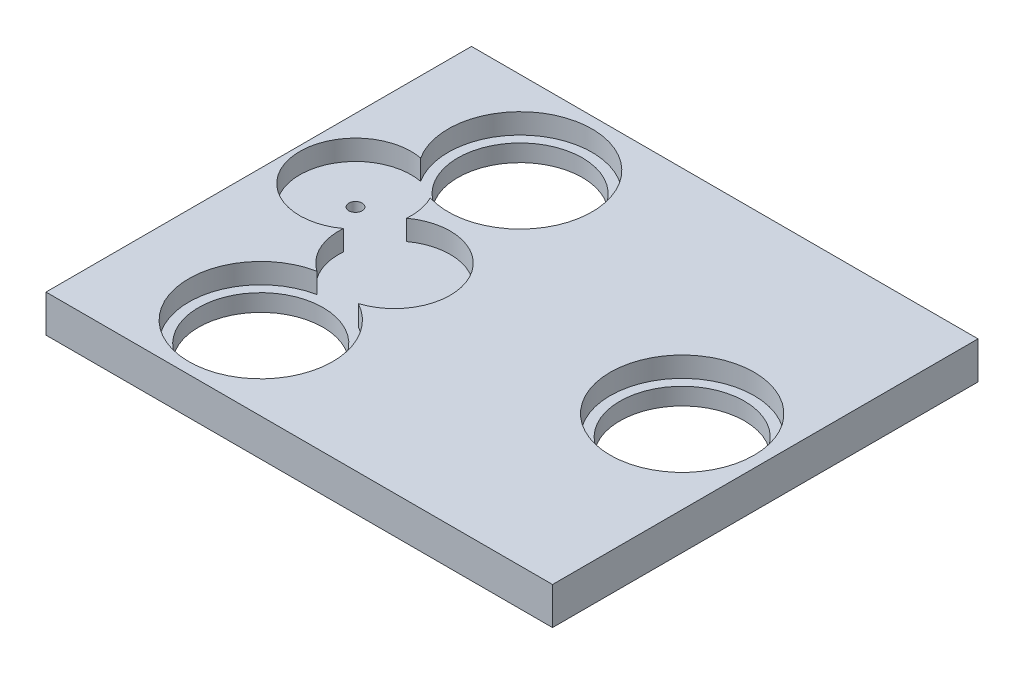
ISO-10303-21;
HEADER;
FILE_DESCRIPTION(('STEP AP214'),'2;1');
FILE_NAME('part.step','',(''),(''),'','','');
FILE_SCHEMA(('AUTOMOTIVE_DESIGN { 1 0 10303 214 1 1 1 1 }'));
ENDSEC;
DATA;
#1=APPLICATION_CONTEXT('core data for automotive mechanical design processes');
#2=APPLICATION_PROTOCOL_DEFINITION('international standard','automotive_design',2000,#1);
#3=PRODUCT_CONTEXT('',#1,'mechanical');
#4=PRODUCT('Part','Part','',(#3));
#5=PRODUCT_RELATED_PRODUCT_CATEGORY('part','',(#4));
#6=PRODUCT_DEFINITION_FORMATION('','',#4);
#7=PRODUCT_DEFINITION_CONTEXT('part definition',#1,'design');
#8=PRODUCT_DEFINITION('design','',#6,#7);
#9=PRODUCT_DEFINITION_SHAPE('','',#8);
#10=(LENGTH_UNIT() NAMED_UNIT(*) SI_UNIT(.MILLI.,.METRE.));
#11=(NAMED_UNIT(*) PLANE_ANGLE_UNIT() SI_UNIT($,.RADIAN.));
#12=(NAMED_UNIT(*) SI_UNIT($,.STERADIAN.) SOLID_ANGLE_UNIT());
#13=UNCERTAINTY_MEASURE_WITH_UNIT(LENGTH_MEASURE(1.E-05),#10,'distance_accuracy_value','');
#14=(GEOMETRIC_REPRESENTATION_CONTEXT(3) GLOBAL_UNCERTAINTY_ASSIGNED_CONTEXT((#13)) GLOBAL_UNIT_ASSIGNED_CONTEXT((#10,
#11,#12)) REPRESENTATION_CONTEXT('',''));
#15=CARTESIAN_POINT('',(0.,0.,0.));
#16=DIRECTION('',(0.,0.,1.));
#17=DIRECTION('',(1.,0.,0.));
#18=AXIS2_PLACEMENT_3D('',#15,#16,#17);
#19=CARTESIAN_POINT('',(62.5,9.215,52.5));
#20=DIRECTION('',(-1.,0.,0.));
#21=DIRECTION('',(0.,0.,1.));
#22=AXIS2_PLACEMENT_3D('',#19,#20,#21);
#23=PLANE('',#22);
#24=DIRECTION('',(0.,0.,-1.));
#25=VECTOR('',#24,1.);
#26=CARTESIAN_POINT('',(62.5,0.,52.5));
#27=LINE('',#26,#25);
#28=CARTESIAN_POINT('',(62.5,0.,52.5));
#29=VERTEX_POINT('',#28);
#30=CARTESIAN_POINT('',(62.5,0.,-52.5));
#31=VERTEX_POINT('',#30);
#32=EDGE_CURVE('E179',#29,#31,#27,.T.);
#33=ORIENTED_EDGE('',*,*,#32,.T.);
#34=DIRECTION('',(0.,-1.,0.));
#35=VECTOR('',#34,1.);
#36=CARTESIAN_POINT('',(62.5,9.215,-52.5));
#37=LINE('',#36,#35);
#38=CARTESIAN_POINT('',(62.5,9.215,-52.5));
#39=VERTEX_POINT('',#38);
#40=EDGE_CURVE('E11',#39,#31,#37,.T.);
#41=ORIENTED_EDGE('',*,*,#40,.F.);
#42=DIRECTION('',(0.,0.,-1.));
#43=VECTOR('',#42,1.);
#44=CARTESIAN_POINT('',(62.5,9.215,52.5));
#45=LINE('',#44,#43);
#46=CARTESIAN_POINT('',(62.5,9.215,52.5));
#47=VERTEX_POINT('',#46);
#48=EDGE_CURVE('E180',#47,#39,#45,.T.);
#49=ORIENTED_EDGE('',*,*,#48,.F.);
#50=DIRECTION('',(0.,-1.,0.));
#51=VECTOR('',#50,1.);
#52=CARTESIAN_POINT('',(62.5,9.215,52.5));
#53=LINE('',#52,#51);
#54=EDGE_CURVE('E186',#47,#29,#53,.T.);
#55=ORIENTED_EDGE('',*,*,#54,.T.);
#56=EDGE_LOOP('',(#33,#41,#49,#55));
#57=FACE_BOUND('',#56,.T.);
#58=ADVANCED_FACE('F35',(#57),#23,.F.);
#59=CARTESIAN_POINT('',(-62.5,9.215,-52.5));
#60=DIRECTION('',(0.,0.,1.));
#61=DIRECTION('',(1.,0.,0.));
#62=AXIS2_PLACEMENT_3D('',#59,#60,#61);
#63=PLANE('',#62);
#64=DIRECTION('',(-1.,0.,0.));
#65=VECTOR('',#64,1.);
#66=CARTESIAN_POINT('',(-62.5,0.,-52.5));
#67=LINE('',#66,#65);
#68=CARTESIAN_POINT('',(-62.5,0.,-52.5));
#69=VERTEX_POINT('',#68);
#70=EDGE_CURVE('E189',#31,#69,#67,.T.);
#71=ORIENTED_EDGE('',*,*,#70,.T.);
#72=DIRECTION('',(0.,-1.,0.));
#73=VECTOR('',#72,1.);
#74=CARTESIAN_POINT('',(-62.5,9.215,-52.5));
#75=LINE('',#74,#73);
#76=CARTESIAN_POINT('',(-62.5,9.215,-52.5));
#77=VERTEX_POINT('',#76);
#78=EDGE_CURVE('E43',#77,#69,#75,.T.);
#79=ORIENTED_EDGE('',*,*,#78,.F.);
#80=DIRECTION('',(-1.,0.,0.));
#81=VECTOR('',#80,1.);
#82=CARTESIAN_POINT('',(-62.5,9.215,-52.5));
#83=LINE('',#82,#81);
#84=EDGE_CURVE('E88',#39,#77,#83,.T.);
#85=ORIENTED_EDGE('',*,*,#84,.F.);
#86=ORIENTED_EDGE('',*,*,#40,.T.);
#87=EDGE_LOOP('',(#71,#79,#85,#86));
#88=FACE_BOUND('',#87,.T.);
#89=ADVANCED_FACE('F223',(#88),#63,.F.);
#90=CARTESIAN_POINT('',(-62.5,9.215,52.5));
#91=DIRECTION('',(1.,0.,0.));
#92=DIRECTION('',(0.,0.,-1.));
#93=AXIS2_PLACEMENT_3D('',#90,#91,#92);
#94=PLANE('',#93);
#95=DIRECTION('',(0.,0.,1.));
#96=VECTOR('',#95,1.);
#97=CARTESIAN_POINT('',(-62.5,0.,52.5));
#98=LINE('',#97,#96);
#99=CARTESIAN_POINT('',(-62.5,0.,52.5));
#100=VERTEX_POINT('',#99);
#101=EDGE_CURVE('E191',#69,#100,#98,.T.);
#102=ORIENTED_EDGE('',*,*,#101,.T.);
#103=DIRECTION('',(0.,-1.,0.));
#104=VECTOR('',#103,1.);
#105=CARTESIAN_POINT('',(-62.5,9.215,52.5));
#106=LINE('',#105,#104);
#107=CARTESIAN_POINT('',(-62.5,9.215,52.5));
#108=VERTEX_POINT('',#107);
#109=EDGE_CURVE('E195',#108,#100,#106,.T.);
#110=ORIENTED_EDGE('',*,*,#109,.F.);
#111=DIRECTION('',(0.,0.,1.));
#112=VECTOR('',#111,1.);
#113=CARTESIAN_POINT('',(-62.5,9.215,52.5));
#114=LINE('',#113,#112);
#115=EDGE_CURVE('E183',#77,#108,#114,.T.);
#116=ORIENTED_EDGE('',*,*,#115,.F.);
#117=ORIENTED_EDGE('',*,*,#78,.T.);
#118=EDGE_LOOP('',(#102,#110,#116,#117));
#119=FACE_BOUND('',#118,.T.);
#120=ADVANCED_FACE('F228',(#119),#94,.F.);
#121=CARTESIAN_POINT('',(-62.5,9.215,52.5));
#122=DIRECTION('',(0.,0.,-1.));
#123=DIRECTION('',(-1.,0.,0.));
#124=AXIS2_PLACEMENT_3D('',#121,#122,#123);
#125=PLANE('',#124);
#126=DIRECTION('',(1.,0.,0.));
#127=VECTOR('',#126,1.);
#128=CARTESIAN_POINT('',(-62.5,0.,52.5));
#129=LINE('',#128,#127);
#130=EDGE_CURVE('E81',#100,#29,#129,.T.);
#131=ORIENTED_EDGE('',*,*,#130,.T.);
#132=ORIENTED_EDGE('',*,*,#54,.F.);
#133=DIRECTION('',(1.,0.,0.));
#134=VECTOR('',#133,1.);
#135=CARTESIAN_POINT('',(-62.5,9.215,52.5));
#136=LINE('',#135,#134);
#137=EDGE_CURVE('E60',#108,#47,#136,.T.);
#138=ORIENTED_EDGE('',*,*,#137,.F.);
#139=ORIENTED_EDGE('',*,*,#109,.T.);
#140=EDGE_LOOP('',(#131,#132,#138,#139));
#141=FACE_BOUND('',#140,.T.);
#142=ADVANCED_FACE('F240',(#141),#125,.F.);
#143=CARTESIAN_POINT('',(0.,9.215,0.));
#144=DIRECTION('',(0.,-1.,0.));
#145=DIRECTION('',(0.,0.,-1.));
#146=AXIS2_PLACEMENT_3D('',#143,#144,#145);
#147=PLANE('',#146);
#148=CARTESIAN_POINT('',(-47.5,9.215,-8.87533784030565));
#149=DIRECTION('',(0.,-1.,0.));
#150=DIRECTION('',(0.,0.,-1.));
#151=AXIS2_PLACEMENT_3D('',#148,#149,#150);
#152=CIRCLE('',#151,13.75);
#153=CARTESIAN_POINT('',(-44.917446939934,9.215,-22.3806301248859));
#154=VERTEX_POINT('',#153);
#155=CARTESIAN_POINT('',(-39.3843908448113,9.215,2.22418413319473));
#156=VERTEX_POINT('',#155);
#157=EDGE_CURVE('E402',#154,#156,#152,.F.);
#158=ORIENTED_EDGE('',*,*,#157,.F.);
#159=CARTESIAN_POINT('',(-30.,9.215,-32.));
#160=DIRECTION('',(0.,-1.,0.));
#161=DIRECTION('',(0.,0.,-1.));
#162=AXIS2_PLACEMENT_3D('',#159,#160,#161);
#163=CIRCLE('',#162,17.75);
#164=CARTESIAN_POINT('',(-35.2044317758804,9.215,-15.0301328853109));
#165=VERTEX_POINT('',#164);
#166=EDGE_CURVE('E149',#165,#154,#163,.F.);
#167=ORIENTED_EDGE('',*,*,#166,.F.);
#168=CARTESIAN_POINT('',(-47.5,9.215,-8.87533784030565));
#169=DIRECTION('',(0.,-1.,0.));
#170=DIRECTION('',(0.,0.,-1.));
#171=AXIS2_PLACEMENT_3D('',#168,#169,#170);
#172=CIRCLE('',#171,13.75);
#173=CARTESIAN_POINT('',(-33.7940403662171,9.215,-7.77571494262004));
#174=VERTEX_POINT('',#173);
#175=EDGE_CURVE('E125',#174,#165,#172,.F.);
#176=ORIENTED_EDGE('',*,*,#175,.F.);
#177=CARTESIAN_POINT('',(-25.6784312110284,9.215,3.32380703088033));
#178=DIRECTION('',(0.,-1.,0.));
#179=DIRECTION('',(0.,0.,-1.));
#180=AXIS2_PLACEMENT_3D('',#177,#178,#179);
#181=CIRCLE('',#180,13.75);
#182=CARTESIAN_POINT('',(-21.4930754201494,9.215,16.42133721423));
#183=VERTEX_POINT('',#182);
#184=EDGE_CURVE('E158',#183,#174,#181,.F.);
#185=ORIENTED_EDGE('',*,*,#184,.F.);
#186=CARTESIAN_POINT('',(-30.,9.215,32.));
#187=DIRECTION('',(0.,-1.,0.));
#188=DIRECTION('',(0.,0.,-1.));
#189=AXIS2_PLACEMENT_3D('',#186,#187,#188);
#190=CIRCLE('',#189,17.75);
#191=CARTESIAN_POINT('',(-33.5378912636371,9.215,14.6061555311461));
#192=VERTEX_POINT('',#191);
#193=EDGE_CURVE('E399',#192,#183,#190,.F.);
#194=ORIENTED_EDGE('',*,*,#193,.F.);
#195=CARTESIAN_POINT('',(-25.6784312110284,9.215,3.32380703088033));
#196=DIRECTION('',(0.,-1.,0.));
#197=DIRECTION('',(0.,0.,-1.));
#198=AXIS2_PLACEMENT_3D('',#195,#196,#197);
#199=CIRCLE('',#198,13.75);
#200=EDGE_CURVE('E403',#156,#192,#199,.F.);
#201=ORIENTED_EDGE('',*,*,#200,.F.);
#202=EDGE_LOOP('',(#158,#167,#176,#185,#194,#201));
#203=FACE_BOUND('',#202,.T.);
#204=CARTESIAN_POINT('',(42.,9.215,0.));
#205=DIRECTION('',(0.,-1.,0.));
#206=DIRECTION('',(0.,0.,-1.));
#207=AXIS2_PLACEMENT_3D('',#204,#205,#206);
#208=CIRCLE('',#207,17.75);
#209=CARTESIAN_POINT('',(42.,9.215,-17.75));
#210=VERTEX_POINT('',#209);
#211=EDGE_CURVE('E176',#210,#210,#208,.F.);
#212=ORIENTED_EDGE('',*,*,#211,.F.);
#213=EDGE_LOOP('',(#212));
#214=FACE_BOUND('',#213,.T.);
#215=ORIENTED_EDGE('',*,*,#48,.T.);
#216=ORIENTED_EDGE('',*,*,#84,.T.);
#217=ORIENTED_EDGE('',*,*,#115,.T.);
#218=ORIENTED_EDGE('',*,*,#137,.T.);
#219=EDGE_LOOP('',(#215,#216,#217,#218));
#220=FACE_BOUND('',#219,.T.);
#221=ADVANCED_FACE('F238',(#203,#214,#220),#147,.F.);
#222=CARTESIAN_POINT('',(0.,0.,0.));
#223=DIRECTION('',(0.,-1.,0.));
#224=DIRECTION('',(0.,0.,-1.));
#225=AXIS2_PLACEMENT_3D('',#222,#223,#224);
#226=PLANE('',#225);
#227=CARTESIAN_POINT('',(-30.,0.,32.));
#228=DIRECTION('',(0.,-1.,0.));
#229=DIRECTION('',(0.,0.,-1.));
#230=AXIS2_PLACEMENT_3D('',#227,#228,#229);
#231=CIRCLE('',#230,15.375);
#232=CARTESIAN_POINT('',(-30.,0.,16.625));
#233=VERTEX_POINT('',#232);
#234=EDGE_CURVE('E201',#233,#233,#231,.T.);
#235=ORIENTED_EDGE('',*,*,#234,.F.);
#236=EDGE_LOOP('',(#235));
#237=FACE_BOUND('',#236,.T.);
#238=CARTESIAN_POINT('',(-30.,0.,-32.));
#239=DIRECTION('',(0.,-1.,0.));
#240=DIRECTION('',(0.,0.,-1.));
#241=AXIS2_PLACEMENT_3D('',#238,#239,#240);
#242=CIRCLE('',#241,15.375);
#243=CARTESIAN_POINT('',(-30.,0.,-47.375));
#244=VERTEX_POINT('',#243);
#245=EDGE_CURVE('E411',#244,#244,#242,.T.);
#246=ORIENTED_EDGE('',*,*,#245,.F.);
#247=EDGE_LOOP('',(#246));
#248=FACE_BOUND('',#247,.T.);
#249=CARTESIAN_POINT('',(-47.5,0.,-8.87533784030565));
#250=DIRECTION('',(0.,-1.,0.));
#251=DIRECTION('',(0.,0.,-1.));
#252=AXIS2_PLACEMENT_3D('',#249,#250,#251);
#253=CIRCLE('',#252,1.65);
#254=CARTESIAN_POINT('',(-47.5,0.,-10.5253378403056));
#255=VERTEX_POINT('',#254);
#256=EDGE_CURVE('E408',#255,#255,#253,.T.);
#257=ORIENTED_EDGE('',*,*,#256,.F.);
#258=EDGE_LOOP('',(#257));
#259=FACE_BOUND('',#258,.T.);
#260=CARTESIAN_POINT('',(42.,0.,0.));
#261=DIRECTION('',(0.,-1.,0.));
#262=DIRECTION('',(0.,0.,-1.));
#263=AXIS2_PLACEMENT_3D('',#260,#261,#262);
#264=CIRCLE('',#263,15.375);
#265=CARTESIAN_POINT('',(42.,0.,-15.375));
#266=VERTEX_POINT('',#265);
#267=EDGE_CURVE('E167',#266,#266,#264,.T.);
#268=ORIENTED_EDGE('',*,*,#267,.F.);
#269=EDGE_LOOP('',(#268));
#270=FACE_BOUND('',#269,.T.);
#271=ORIENTED_EDGE('',*,*,#32,.F.);
#272=ORIENTED_EDGE('',*,*,#130,.F.);
#273=ORIENTED_EDGE('',*,*,#101,.F.);
#274=ORIENTED_EDGE('',*,*,#70,.F.);
#275=EDGE_LOOP('',(#271,#272,#273,#274));
#276=FACE_BOUND('',#275,.T.);
#277=ADVANCED_FACE('F233',(#237,#248,#259,#270,#276),#226,.T.);
#278=CARTESIAN_POINT('',(42.,59.4195814642449,0.));
#279=DIRECTION('',(0.,-1.,0.));
#280=DIRECTION('',(0.,0.,-1.));
#281=AXIS2_PLACEMENT_3D('',#278,#279,#280);
#282=CYLINDRICAL_SURFACE('',#281,17.75);
#283=ORIENTED_EDGE('',*,*,#211,.T.);
#284=EDGE_LOOP('',(#283));
#285=FACE_BOUND('',#284,.T.);
#286=CARTESIAN_POINT('',(42.,4.215,0.));
#287=DIRECTION('',(0.,-1.,0.));
#288=DIRECTION('',(0.,0.,-1.));
#289=AXIS2_PLACEMENT_3D('',#286,#287,#288);
#290=CIRCLE('',#289,17.75);
#291=CARTESIAN_POINT('',(42.,4.215,-17.75));
#292=VERTEX_POINT('',#291);
#293=EDGE_CURVE('E173',#292,#292,#290,.T.);
#294=ORIENTED_EDGE('',*,*,#293,.T.);
#295=EDGE_LOOP('',(#294));
#296=FACE_BOUND('',#295,.T.);
#297=ADVANCED_FACE('F247',(#285,#296),#282,.F.);
#298=CARTESIAN_POINT('',(42.,4.215,0.));
#299=DIRECTION('',(0.,-1.,0.));
#300=DIRECTION('',(0.,0.,-1.));
#301=AXIS2_PLACEMENT_3D('',#298,#299,#300);
#302=PLANE('',#301);
#303=CARTESIAN_POINT('',(42.,4.215,0.));
#304=DIRECTION('',(0.,-1.,0.));
#305=DIRECTION('',(0.,0.,-1.));
#306=AXIS2_PLACEMENT_3D('',#303,#304,#305);
#307=CIRCLE('',#306,15.375);
#308=CARTESIAN_POINT('',(42.,4.215,-15.375));
#309=VERTEX_POINT('',#308);
#310=EDGE_CURVE('E170',#309,#309,#307,.F.);
#311=ORIENTED_EDGE('',*,*,#310,.F.);
#312=EDGE_LOOP('',(#311));
#313=FACE_BOUND('',#312,.T.);
#314=ORIENTED_EDGE('',*,*,#293,.F.);
#315=EDGE_LOOP('',(#314));
#316=FACE_BOUND('',#315,.T.);
#317=ADVANCED_FACE('F275',(#313,#316),#302,.F.);
#318=CARTESIAN_POINT('',(42.,47.7020670429727,0.));
#319=DIRECTION('',(0.,-1.,0.));
#320=DIRECTION('',(0.,0.,-1.));
#321=AXIS2_PLACEMENT_3D('',#318,#319,#320);
#322=CYLINDRICAL_SURFACE('',#321,15.375);
#323=ORIENTED_EDGE('',*,*,#310,.T.);
#324=EDGE_LOOP('',(#323));
#325=FACE_BOUND('',#324,.T.);
#326=ORIENTED_EDGE('',*,*,#267,.T.);
#327=EDGE_LOOP('',(#326));
#328=FACE_BOUND('',#327,.T.);
#329=ADVANCED_FACE('F285',(#325,#328),#322,.F.);
#330=CARTESIAN_POINT('',(-30.,120.268442755302,-32.));
#331=DIRECTION('',(0.,-1.,0.));
#332=DIRECTION('',(0.,0.,-1.));
#333=AXIS2_PLACEMENT_3D('',#330,#331,#332);
#334=CYLINDRICAL_SURFACE('',#333,17.75);
#335=ORIENTED_EDGE('',*,*,#166,.T.);
#336=DIRECTION('',(0.,-1.,0.));
#337=VECTOR('',#336,1.);
#338=CARTESIAN_POINT('',(-44.917446939934,120.268442755302,-22.3806301248859));
#339=LINE('',#338,#337);
#340=CARTESIAN_POINT('',(-44.917446939934,4.215,-22.3806301248859));
#341=VERTEX_POINT('',#340);
#342=EDGE_CURVE('E144',#154,#341,#339,.T.);
#343=ORIENTED_EDGE('',*,*,#342,.T.);
#344=CARTESIAN_POINT('',(-30.,4.215,-32.));
#345=DIRECTION('',(0.,-1.,0.));
#346=DIRECTION('',(0.,0.,-1.));
#347=AXIS2_PLACEMENT_3D('',#344,#345,#346);
#348=CIRCLE('',#347,17.75);
#349=CARTESIAN_POINT('',(-35.2044317758804,4.215,-15.0301328853109));
#350=VERTEX_POINT('',#349);
#351=EDGE_CURVE('E136',#341,#350,#348,.T.);
#352=ORIENTED_EDGE('',*,*,#351,.T.);
#353=DIRECTION('',(0.,-1.,0.));
#354=VECTOR('',#353,1.);
#355=CARTESIAN_POINT('',(-35.2044317758804,120.268442755302,-15.0301328853109));
#356=LINE('',#355,#354);
#357=EDGE_CURVE('E120',#165,#350,#356,.T.);
#358=ORIENTED_EDGE('',*,*,#357,.F.);
#359=EDGE_LOOP('',(#335,#343,#352,#358));
#360=FACE_BOUND('',#359,.T.);
#361=ADVANCED_FACE('F142',(#360),#334,.F.);
#362=CARTESIAN_POINT('',(-47.5,120.268442755302,-8.87533784030565));
#363=DIRECTION('',(0.,-1.,0.));
#364=DIRECTION('',(0.,0.,-1.));
#365=AXIS2_PLACEMENT_3D('',#362,#363,#364);
#366=CYLINDRICAL_SURFACE('',#365,13.75);
#367=ORIENTED_EDGE('',*,*,#157,.T.);
#368=DIRECTION('',(0.,-1.,0.));
#369=VECTOR('',#368,1.);
#370=CARTESIAN_POINT('',(-39.3843908448113,120.268442755302,2.22418413319473));
#371=LINE('',#370,#369);
#372=CARTESIAN_POINT('',(-39.3843908448113,4.215,2.22418413319473));
#373=VERTEX_POINT('',#372);
#374=EDGE_CURVE('E159',#156,#373,#371,.T.);
#375=ORIENTED_EDGE('',*,*,#374,.T.);
#376=CARTESIAN_POINT('',(-47.5,4.215,-8.87533784030565));
#377=DIRECTION('',(0.,-1.,0.));
#378=DIRECTION('',(0.,0.,-1.));
#379=AXIS2_PLACEMENT_3D('',#376,#377,#378);
#380=CIRCLE('',#379,13.75);
#381=EDGE_CURVE('E129',#373,#341,#380,.T.);
#382=ORIENTED_EDGE('',*,*,#381,.T.);
#383=ORIENTED_EDGE('',*,*,#342,.F.);
#384=EDGE_LOOP('',(#367,#375,#382,#383));
#385=FACE_BOUND('',#384,.T.);
#386=ADVANCED_FACE('F306',(#385),#366,.F.);
#387=CARTESIAN_POINT('',(-25.6784312110284,120.268442755302,3.32380703088033));
#388=DIRECTION('',(0.,-1.,0.));
#389=DIRECTION('',(0.,0.,-1.));
#390=AXIS2_PLACEMENT_3D('',#387,#388,#389);
#391=CYLINDRICAL_SURFACE('',#390,13.75);
#392=ORIENTED_EDGE('',*,*,#200,.T.);
#393=DIRECTION('',(0.,-1.,0.));
#394=VECTOR('',#393,1.);
#395=CARTESIAN_POINT('',(-33.5378912636371,120.268442755302,14.6061555311461));
#396=LINE('',#395,#394);
#397=CARTESIAN_POINT('',(-33.5378912636371,4.215,14.6061555311461));
#398=VERTEX_POINT('',#397);
#399=EDGE_CURVE('E161',#192,#398,#396,.T.);
#400=ORIENTED_EDGE('',*,*,#399,.T.);
#401=CARTESIAN_POINT('',(-25.6784312110284,4.215,3.32380703088033));
#402=DIRECTION('',(0.,-1.,0.));
#403=DIRECTION('',(0.,0.,-1.));
#404=AXIS2_PLACEMENT_3D('',#401,#402,#403);
#405=CIRCLE('',#404,13.75);
#406=EDGE_CURVE('E154',#398,#373,#405,.T.);
#407=ORIENTED_EDGE('',*,*,#406,.T.);
#408=ORIENTED_EDGE('',*,*,#374,.F.);
#409=EDGE_LOOP('',(#392,#400,#407,#408));
#410=FACE_BOUND('',#409,.T.);
#411=ADVANCED_FACE('F315',(#410),#391,.F.);
#412=CARTESIAN_POINT('',(-30.,120.268442755302,32.));
#413=DIRECTION('',(0.,-1.,0.));
#414=DIRECTION('',(0.,0.,-1.));
#415=AXIS2_PLACEMENT_3D('',#412,#413,#414);
#416=CYLINDRICAL_SURFACE('',#415,17.75);
#417=ORIENTED_EDGE('',*,*,#193,.T.);
#418=DIRECTION('',(0.,-1.,0.));
#419=VECTOR('',#418,1.);
#420=CARTESIAN_POINT('',(-21.4930754201494,120.268442755302,16.42133721423));
#421=LINE('',#420,#419);
#422=CARTESIAN_POINT('',(-21.4930754201494,4.215,16.42133721423));
#423=VERTEX_POINT('',#422);
#424=EDGE_CURVE('E163',#183,#423,#421,.T.);
#425=ORIENTED_EDGE('',*,*,#424,.T.);
#426=CARTESIAN_POINT('',(-30.,4.215,32.));
#427=DIRECTION('',(0.,-1.,0.));
#428=DIRECTION('',(0.,0.,-1.));
#429=AXIS2_PLACEMENT_3D('',#426,#427,#428);
#430=CIRCLE('',#429,17.75);
#431=EDGE_CURVE('E153',#423,#398,#430,.T.);
#432=ORIENTED_EDGE('',*,*,#431,.T.);
#433=ORIENTED_EDGE('',*,*,#399,.F.);
#434=EDGE_LOOP('',(#417,#425,#432,#433));
#435=FACE_BOUND('',#434,.T.);
#436=ADVANCED_FACE('F325',(#435),#416,.F.);
#437=ORIENTED_EDGE('',*,*,#184,.T.);
#438=DIRECTION('',(0.,-1.,0.));
#439=VECTOR('',#438,1.);
#440=CARTESIAN_POINT('',(-33.7940403662171,120.268442755302,-7.77571494262004));
#441=LINE('',#440,#439);
#442=CARTESIAN_POINT('',(-33.7940403662171,4.215,-7.77571494262004));
#443=VERTEX_POINT('',#442);
#444=EDGE_CURVE('E51',#174,#443,#441,.T.);
#445=ORIENTED_EDGE('',*,*,#444,.T.);
#446=EDGE_CURVE('E140',#443,#423,#405,.T.);
#447=ORIENTED_EDGE('',*,*,#446,.T.);
#448=ORIENTED_EDGE('',*,*,#424,.F.);
#449=EDGE_LOOP('',(#437,#445,#447,#448));
#450=FACE_BOUND('',#449,.T.);
#451=ADVANCED_FACE('F328',(#450),#391,.F.);
#452=ORIENTED_EDGE('',*,*,#175,.T.);
#453=ORIENTED_EDGE('',*,*,#357,.T.);
#454=EDGE_CURVE('E123',#350,#443,#380,.T.);
#455=ORIENTED_EDGE('',*,*,#454,.T.);
#456=ORIENTED_EDGE('',*,*,#444,.F.);
#457=EDGE_LOOP('',(#452,#453,#455,#456));
#458=FACE_BOUND('',#457,.T.);
#459=ADVANCED_FACE('F122',(#458),#366,.F.);
#460=CARTESIAN_POINT('',(0.,4.215,0.));
#461=DIRECTION('',(0.,-1.,0.));
#462=DIRECTION('',(0.,0.,-1.));
#463=AXIS2_PLACEMENT_3D('',#460,#461,#462);
#464=PLANE('',#463);
#465=CARTESIAN_POINT('',(-30.,4.215,32.));
#466=DIRECTION('',(0.,-1.,0.));
#467=DIRECTION('',(0.,0.,-1.));
#468=AXIS2_PLACEMENT_3D('',#465,#466,#467);
#469=CIRCLE('',#468,15.375);
#470=CARTESIAN_POINT('',(-30.,4.215,16.625));
#471=VERTEX_POINT('',#470);
#472=EDGE_CURVE('E38',#471,#471,#469,.T.);
#473=ORIENTED_EDGE('',*,*,#472,.T.);
#474=EDGE_LOOP('',(#473));
#475=FACE_BOUND('',#474,.T.);
#476=CARTESIAN_POINT('',(-30.,4.215,-32.));
#477=DIRECTION('',(0.,-1.,0.));
#478=DIRECTION('',(0.,0.,-1.));
#479=AXIS2_PLACEMENT_3D('',#476,#477,#478);
#480=CIRCLE('',#479,15.375);
#481=CARTESIAN_POINT('',(-30.,4.215,-47.375));
#482=VERTEX_POINT('',#481);
#483=EDGE_CURVE('E147',#482,#482,#480,.T.);
#484=ORIENTED_EDGE('',*,*,#483,.T.);
#485=EDGE_LOOP('',(#484));
#486=FACE_BOUND('',#485,.T.);
#487=CARTESIAN_POINT('',(-47.5,4.215,-8.87533784030565));
#488=DIRECTION('',(0.,-1.,0.));
#489=DIRECTION('',(0.,0.,-1.));
#490=AXIS2_PLACEMENT_3D('',#487,#488,#489);
#491=CIRCLE('',#490,1.65);
#492=CARTESIAN_POINT('',(-47.5,4.215,-10.5253378403056));
#493=VERTEX_POINT('',#492);
#494=EDGE_CURVE('E199',#493,#493,#491,.T.);
#495=ORIENTED_EDGE('',*,*,#494,.T.);
#496=EDGE_LOOP('',(#495));
#497=FACE_BOUND('',#496,.T.);
#498=ORIENTED_EDGE('',*,*,#351,.F.);
#499=ORIENTED_EDGE('',*,*,#381,.F.);
#500=ORIENTED_EDGE('',*,*,#406,.F.);
#501=ORIENTED_EDGE('',*,*,#431,.F.);
#502=ORIENTED_EDGE('',*,*,#446,.F.);
#503=ORIENTED_EDGE('',*,*,#454,.F.);
#504=EDGE_LOOP('',(#498,#499,#500,#501,#502,#503));
#505=FACE_BOUND('',#504,.T.);
#506=ADVANCED_FACE('F134',(#475,#486,#497,#505),#464,.F.);
#507=CARTESIAN_POINT('',(-47.5,9.215,-8.87533784030565));
#508=DIRECTION('',(0.,-1.,0.));
#509=DIRECTION('',(0.,0.,-1.));
#510=AXIS2_PLACEMENT_3D('',#507,#508,#509);
#511=CYLINDRICAL_SURFACE('',#510,1.65);
#512=ORIENTED_EDGE('',*,*,#256,.T.);
#513=EDGE_LOOP('',(#512));
#514=FACE_BOUND('',#513,.T.);
#515=ORIENTED_EDGE('',*,*,#494,.F.);
#516=EDGE_LOOP('',(#515));
#517=FACE_BOUND('',#516,.T.);
#518=ADVANCED_FACE('F210',(#514,#517),#511,.F.);
#519=CARTESIAN_POINT('',(-30.,9.215,-32.));
#520=DIRECTION('',(0.,-1.,0.));
#521=DIRECTION('',(0.,0.,-1.));
#522=AXIS2_PLACEMENT_3D('',#519,#520,#521);
#523=CYLINDRICAL_SURFACE('',#522,15.375);
#524=ORIENTED_EDGE('',*,*,#245,.T.);
#525=EDGE_LOOP('',(#524));
#526=FACE_BOUND('',#525,.T.);
#527=ORIENTED_EDGE('',*,*,#483,.F.);
#528=EDGE_LOOP('',(#527));
#529=FACE_BOUND('',#528,.T.);
#530=ADVANCED_FACE('F207',(#526,#529),#523,.F.);
#531=CARTESIAN_POINT('',(-30.,9.215,32.));
#532=DIRECTION('',(0.,-1.,0.));
#533=DIRECTION('',(0.,0.,-1.));
#534=AXIS2_PLACEMENT_3D('',#531,#532,#533);
#535=CYLINDRICAL_SURFACE('',#534,15.375);
#536=ORIENTED_EDGE('',*,*,#234,.T.);
#537=EDGE_LOOP('',(#536));
#538=FACE_BOUND('',#537,.T.);
#539=ORIENTED_EDGE('',*,*,#472,.F.);
#540=EDGE_LOOP('',(#539));
#541=FACE_BOUND('',#540,.T.);
#542=ADVANCED_FACE('F209',(#538,#541),#535,.F.);
#543=CLOSED_SHELL('',(#58,#89,#120,#142,#221,#277,#297,#317,#329,#361,#386,#411,#436,#451,#459,
#506,#518,#530,#542));
#544=MANIFOLD_SOLID_BREP('B2',#543);
#545=ADVANCED_BREP_SHAPE_REPRESENTATION('',(#18,#544),#14);
#546=SHAPE_DEFINITION_REPRESENTATION(#9,#545);
ENDSEC;
END-ISO-10303-21;
